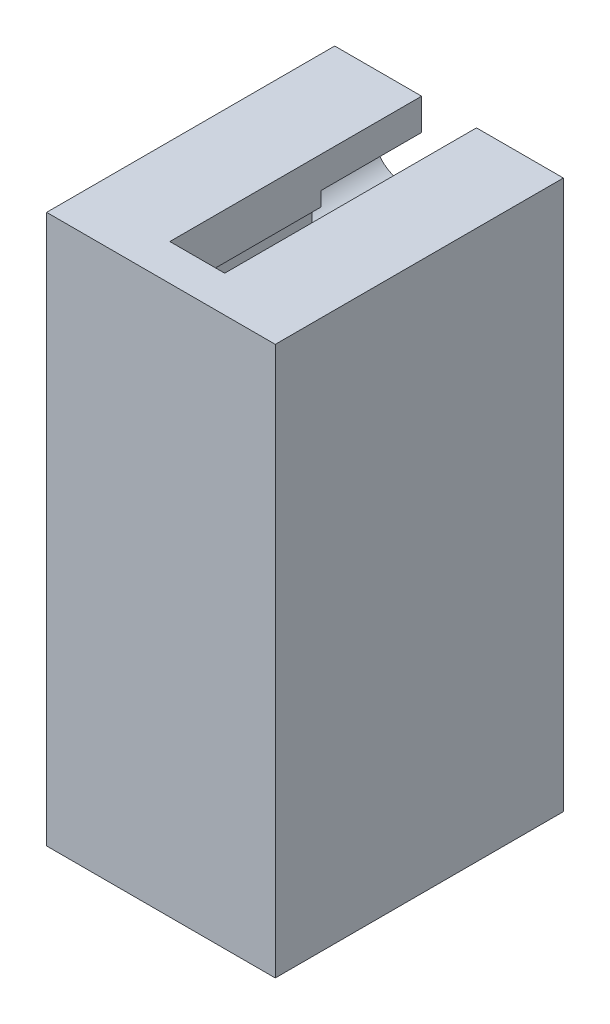
ISO-10303-21;
HEADER;
FILE_DESCRIPTION(('STEP AP214'),'2;1');
FILE_NAME('part.step','',(''),(''),'','','');
FILE_SCHEMA(('AUTOMOTIVE_DESIGN { 1 0 10303 214 1 1 1 1 }'));
ENDSEC;
DATA;
#1=APPLICATION_CONTEXT('core data for automotive mechanical design processes');
#2=APPLICATION_PROTOCOL_DEFINITION('international standard','automotive_design',2000,#1);
#3=PRODUCT_CONTEXT('',#1,'mechanical');
#4=PRODUCT('Part','Part','',(#3));
#5=PRODUCT_RELATED_PRODUCT_CATEGORY('part','',(#4));
#6=PRODUCT_DEFINITION_FORMATION('','',#4);
#7=PRODUCT_DEFINITION_CONTEXT('part definition',#1,'design');
#8=PRODUCT_DEFINITION('design','',#6,#7);
#9=PRODUCT_DEFINITION_SHAPE('','',#8);
#10=(LENGTH_UNIT() NAMED_UNIT(*) SI_UNIT(.MILLI.,.METRE.));
#11=(NAMED_UNIT(*) PLANE_ANGLE_UNIT() SI_UNIT($,.RADIAN.));
#12=(NAMED_UNIT(*) SI_UNIT($,.STERADIAN.) SOLID_ANGLE_UNIT());
#13=UNCERTAINTY_MEASURE_WITH_UNIT(LENGTH_MEASURE(1.E-05),#10,'distance_accuracy_value','');
#14=(GEOMETRIC_REPRESENTATION_CONTEXT(3) GLOBAL_UNCERTAINTY_ASSIGNED_CONTEXT((#13)) GLOBAL_UNIT_ASSIGNED_CONTEXT((#10,
#11,#12)) REPRESENTATION_CONTEXT('',''));
#15=CARTESIAN_POINT('',(0.,0.,0.));
#16=DIRECTION('',(0.,0.,1.));
#17=DIRECTION('',(1.,0.,0.));
#18=AXIS2_PLACEMENT_3D('',#15,#16,#17);
#19=CARTESIAN_POINT('',(0.,45.,-3.96999999999997));
#20=DIRECTION('',(0.,-1.,0.));
#21=DIRECTION('',(0.,0.,-1.));
#22=AXIS2_PLACEMENT_3D('',#19,#20,#21);
#23=PLANE('',#22);
#24=DIRECTION('',(0.,0.,-1.));
#25=VECTOR('',#24,1.);
#26=CARTESIAN_POINT('',(3.,45.,-3.96999999999997));
#27=LINE('',#26,#25);
#28=CARTESIAN_POINT('',(3.,45.,-3.96999999999997));
#29=VERTEX_POINT('',#28);
#30=CARTESIAN_POINT('',(3.,45.,-20.5));
#31=VERTEX_POINT('',#30);
#32=EDGE_CURVE('E244',#29,#31,#27,.T.);
#33=ORIENTED_EDGE('',*,*,#32,.T.);
#34=DIRECTION('',(1.,0.,0.));
#35=VECTOR('',#34,1.);
#36=CARTESIAN_POINT('',(0.,45.,-20.5));
#37=LINE('',#36,#35);
#38=CARTESIAN_POINT('',(4.,45.,-20.5));
#39=VERTEX_POINT('',#38);
#40=EDGE_CURVE('E57',#31,#39,#37,.T.);
#41=ORIENTED_EDGE('',*,*,#40,.T.);
#42=DIRECTION('',(0.,0.,-1.));
#43=VECTOR('',#42,1.);
#44=CARTESIAN_POINT('',(4.,45.,-3.96999999999997));
#45=LINE('',#44,#43);
#46=CARTESIAN_POINT('',(4.,45.,-3.96999999999997));
#47=VERTEX_POINT('',#46);
#48=EDGE_CURVE('E240',#47,#39,#45,.T.);
#49=ORIENTED_EDGE('',*,*,#48,.F.);
#50=DIRECTION('',(-1.,0.,0.));
#51=VECTOR('',#50,1.);
#52=CARTESIAN_POINT('',(0.,45.,-3.96999999999997));
#53=LINE('',#52,#51);
#54=EDGE_CURVE('E333',#47,#29,#53,.T.);
#55=ORIENTED_EDGE('',*,*,#54,.T.);
#56=EDGE_LOOP('',(#33,#41,#49,#55));
#57=FACE_BOUND('',#56,.T.);
#58=ADVANCED_FACE('F41',(#57),#23,.T.);
#59=CARTESIAN_POINT('',(0.,45.,-3.96999999999997));
#60=DIRECTION('',(0.,-1.,0.));
#61=DIRECTION('',(0.,0.,-1.));
#62=AXIS2_PLACEMENT_3D('',#59,#60,#61);
#63=PLANE('',#62);
#64=DIRECTION('',(0.,0.,-1.));
#65=VECTOR('',#64,1.);
#66=CARTESIAN_POINT('',(-4.,45.,-3.96999999999997));
#67=LINE('',#66,#65);
#68=CARTESIAN_POINT('',(-4.,45.,-3.96999999999997));
#69=VERTEX_POINT('',#68);
#70=CARTESIAN_POINT('',(-4.,45.,-20.5));
#71=VERTEX_POINT('',#70);
#72=EDGE_CURVE('E258',#69,#71,#67,.T.);
#73=ORIENTED_EDGE('',*,*,#72,.T.);
#74=DIRECTION('',(1.,0.,0.));
#75=VECTOR('',#74,1.);
#76=CARTESIAN_POINT('',(0.,45.,-20.5));
#77=LINE('',#76,#75);
#78=CARTESIAN_POINT('',(-3.,45.,-20.5));
#79=VERTEX_POINT('',#78);
#80=EDGE_CURVE('E65',#71,#79,#77,.T.);
#81=ORIENTED_EDGE('',*,*,#80,.T.);
#82=DIRECTION('',(0.,0.,-1.));
#83=VECTOR('',#82,1.);
#84=CARTESIAN_POINT('',(-3.,45.,-3.96999999999997));
#85=LINE('',#84,#83);
#86=CARTESIAN_POINT('',(-3.,45.,-3.96999999999997));
#87=VERTEX_POINT('',#86);
#88=EDGE_CURVE('E255',#87,#79,#85,.T.);
#89=ORIENTED_EDGE('',*,*,#88,.F.);
#90=DIRECTION('',(-1.,0.,0.));
#91=VECTOR('',#90,1.);
#92=CARTESIAN_POINT('',(0.,45.,-3.96999999999997));
#93=LINE('',#92,#91);
#94=EDGE_CURVE('E377',#87,#69,#93,.T.);
#95=ORIENTED_EDGE('',*,*,#94,.T.);
#96=EDGE_LOOP('',(#73,#81,#89,#95));
#97=FACE_BOUND('',#96,.T.);
#98=ADVANCED_FACE('F460',(#97),#63,.T.);
#99=CARTESIAN_POINT('',(12.5,0.,-31.5));
#100=DIRECTION('',(0.,0.,-1.));
#101=DIRECTION('',(0.,1.,0.));
#102=AXIS2_PLACEMENT_3D('',#99,#100,#101);
#103=PLANE('',#102);
#104=CARTESIAN_POINT('',(5.,-4.00000000000001,-31.5));
#105=DIRECTION('',(0.,0.,-1.));
#106=DIRECTION('',(0.,1.,0.));
#107=AXIS2_PLACEMENT_3D('',#104,#105,#106);
#108=CIRCLE('',#107,3.25);
#109=CARTESIAN_POINT('',(5.,-0.750000000000013,-31.5));
#110=VERTEX_POINT('',#109);
#111=EDGE_CURVE('E507',#110,#110,#108,.T.);
#112=ORIENTED_EDGE('',*,*,#111,.F.);
#113=EDGE_LOOP('',(#112));
#114=FACE_BOUND('',#113,.T.);
#115=CARTESIAN_POINT('',(-5.,-4.00000000000001,-31.5));
#116=DIRECTION('',(0.,0.,-1.));
#117=DIRECTION('',(0.,1.,0.));
#118=AXIS2_PLACEMENT_3D('',#115,#116,#117);
#119=CIRCLE('',#118,3.25);
#120=CARTESIAN_POINT('',(-5.,-0.750000000000013,-31.5));
#121=VERTEX_POINT('',#120);
#122=EDGE_CURVE('E510',#121,#121,#119,.T.);
#123=ORIENTED_EDGE('',*,*,#122,.F.);
#124=EDGE_LOOP('',(#123));
#125=FACE_BOUND('',#124,.T.);
#126=CARTESIAN_POINT('',(-5.,44.,-31.5));
#127=DIRECTION('',(0.,0.,-1.));
#128=DIRECTION('',(0.,1.,0.));
#129=AXIS2_PLACEMENT_3D('',#126,#127,#128);
#130=CIRCLE('',#129,3.25);
#131=CARTESIAN_POINT('',(-4.,40.9076707807867,-31.5));
#132=VERTEX_POINT('',#131);
#133=CARTESIAN_POINT('',(-3.,46.5617376914899,-31.5));
#134=VERTEX_POINT('',#133);
#135=EDGE_CURVE('E177',#132,#134,#130,.T.);
#136=ORIENTED_EDGE('',*,*,#135,.F.);
#137=DIRECTION('',(0.,-1.,0.));
#138=VECTOR('',#137,1.);
#139=CARTESIAN_POINT('',(-4.,0.,-31.5));
#140=LINE('',#139,#138);
#141=CARTESIAN_POINT('',(-4.,40.015,-31.5));
#142=VERTEX_POINT('',#141);
#143=EDGE_CURVE('E207',#132,#142,#140,.T.);
#144=ORIENTED_EDGE('',*,*,#143,.T.);
#145=DIRECTION('',(1.,0.,0.));
#146=VECTOR('',#145,1.);
#147=CARTESIAN_POINT('',(0.,40.015,-31.5));
#148=LINE('',#147,#146);
#149=CARTESIAN_POINT('',(-10.015,40.015,-31.5));
#150=VERTEX_POINT('',#149);
#151=EDGE_CURVE('E213',#150,#142,#148,.T.);
#152=ORIENTED_EDGE('',*,*,#151,.F.);
#153=DIRECTION('',(0.,1.,0.));
#154=VECTOR('',#153,1.);
#155=CARTESIAN_POINT('',(-10.015,0.,-31.5));
#156=LINE('',#155,#154);
#157=CARTESIAN_POINT('',(-10.015,-0.015000000000007,-31.5));
#158=VERTEX_POINT('',#157);
#159=EDGE_CURVE('E357',#158,#150,#156,.T.);
#160=ORIENTED_EDGE('',*,*,#159,.F.);
#161=DIRECTION('',(1.,0.,0.));
#162=VECTOR('',#161,1.);
#163=CARTESIAN_POINT('',(0.,-0.0150000000000083,-31.5));
#164=LINE('',#163,#162);
#165=CARTESIAN_POINT('',(10.015,-0.0150000000000095,-31.5));
#166=VERTEX_POINT('',#165);
#167=EDGE_CURVE('E353',#158,#166,#164,.T.);
#168=ORIENTED_EDGE('',*,*,#167,.T.);
#169=DIRECTION('',(0.,1.,0.));
#170=VECTOR('',#169,1.);
#171=CARTESIAN_POINT('',(10.015,0.,-31.5));
#172=LINE('',#171,#170);
#173=CARTESIAN_POINT('',(10.015,40.015,-31.5));
#174=VERTEX_POINT('',#173);
#175=EDGE_CURVE('E224',#166,#174,#172,.T.);
#176=ORIENTED_EDGE('',*,*,#175,.T.);
#177=DIRECTION('',(1.,0.,0.));
#178=VECTOR('',#177,1.);
#179=CARTESIAN_POINT('',(0.,40.015,-31.5));
#180=LINE('',#179,#178);
#181=CARTESIAN_POINT('',(4.,40.015,-31.5));
#182=VERTEX_POINT('',#181);
#183=EDGE_CURVE('E220',#182,#174,#180,.T.);
#184=ORIENTED_EDGE('',*,*,#183,.F.);
#185=DIRECTION('',(0.,1.,0.));
#186=VECTOR('',#185,1.);
#187=CARTESIAN_POINT('',(4.,0.,-31.5));
#188=LINE('',#187,#186);
#189=CARTESIAN_POINT('',(4.,40.9076707807867,-31.5));
#190=VERTEX_POINT('',#189);
#191=EDGE_CURVE('E211',#182,#190,#188,.T.);
#192=ORIENTED_EDGE('',*,*,#191,.T.);
#193=CARTESIAN_POINT('',(5.,44.,-31.5));
#194=DIRECTION('',(0.,0.,-1.));
#195=DIRECTION('',(0.,1.,0.));
#196=AXIS2_PLACEMENT_3D('',#193,#194,#195);
#197=CIRCLE('',#196,3.25);
#198=CARTESIAN_POINT('',(3.,46.5617376914899,-31.5));
#199=VERTEX_POINT('',#198);
#200=EDGE_CURVE('E399',#199,#190,#197,.T.);
#201=ORIENTED_EDGE('',*,*,#200,.F.);
#202=DIRECTION('',(0.,1.,0.));
#203=VECTOR('',#202,1.);
#204=CARTESIAN_POINT('',(3.,0.,-31.5));
#205=LINE('',#204,#203);
#206=CARTESIAN_POINT('',(3.,50.,-31.5));
#207=VERTEX_POINT('',#206);
#208=EDGE_CURVE('E206',#199,#207,#205,.T.);
#209=ORIENTED_EDGE('',*,*,#208,.T.);
#210=DIRECTION('',(-1.,0.,0.));
#211=VECTOR('',#210,1.);
#212=CARTESIAN_POINT('',(12.5,50.,-31.5));
#213=LINE('',#212,#211);
#214=CARTESIAN_POINT('',(12.5,50.,-31.5));
#215=VERTEX_POINT('',#214);
#216=EDGE_CURVE('E313',#215,#207,#213,.T.);
#217=ORIENTED_EDGE('',*,*,#216,.F.);
#218=DIRECTION('',(0.,-1.,0.));
#219=VECTOR('',#218,1.);
#220=CARTESIAN_POINT('',(12.5,0.,-31.5));
#221=LINE('',#220,#219);
#222=CARTESIAN_POINT('',(12.5,-10.,-31.5));
#223=VERTEX_POINT('',#222);
#224=EDGE_CURVE('E273',#215,#223,#221,.T.);
#225=ORIENTED_EDGE('',*,*,#224,.T.);
#226=DIRECTION('',(-1.,0.,0.));
#227=VECTOR('',#226,1.);
#228=CARTESIAN_POINT('',(12.5,-10.,-31.5));
#229=LINE('',#228,#227);
#230=CARTESIAN_POINT('',(-12.5,-10.,-31.5));
#231=VERTEX_POINT('',#230);
#232=EDGE_CURVE('E290',#223,#231,#229,.T.);
#233=ORIENTED_EDGE('',*,*,#232,.T.);
#234=DIRECTION('',(0.,-1.,0.));
#235=VECTOR('',#234,1.);
#236=CARTESIAN_POINT('',(-12.5,0.,-31.5));
#237=LINE('',#236,#235);
#238=CARTESIAN_POINT('',(-12.5,50.,-31.5));
#239=VERTEX_POINT('',#238);
#240=EDGE_CURVE('E233',#239,#231,#237,.T.);
#241=ORIENTED_EDGE('',*,*,#240,.F.);
#242=CARTESIAN_POINT('',(-3.,50.,-31.5));
#243=VERTEX_POINT('',#242);
#244=EDGE_CURVE('E204',#243,#239,#213,.T.);
#245=ORIENTED_EDGE('',*,*,#244,.F.);
#246=DIRECTION('',(0.,-1.,0.));
#247=VECTOR('',#246,1.);
#248=CARTESIAN_POINT('',(-3.,0.,-31.5));
#249=LINE('',#248,#247);
#250=EDGE_CURVE('E196',#243,#134,#249,.T.);
#251=ORIENTED_EDGE('',*,*,#250,.T.);
#252=EDGE_LOOP('',(#136,#144,#152,#160,#168,#176,#184,#192,#201,#209,#217,#225,#233,#241,#245,#251));
#253=FACE_BOUND('',#252,.T.);
#254=ADVANCED_FACE('F43',(#114,#125,#253),#103,.T.);
#255=CARTESIAN_POINT('',(12.5,50.,0.));
#256=DIRECTION('',(0.,1.,0.));
#257=DIRECTION('',(0.,0.,1.));
#258=AXIS2_PLACEMENT_3D('',#255,#256,#257);
#259=PLANE('',#258);
#260=ORIENTED_EDGE('',*,*,#216,.T.);
#261=DIRECTION('',(0.,0.,-1.));
#262=VECTOR('',#261,1.);
#263=CARTESIAN_POINT('',(3.,50.,-3.96999999999997));
#264=LINE('',#263,#262);
#265=CARTESIAN_POINT('',(3.,50.,-3.96999999999997));
#266=VERTEX_POINT('',#265);
#267=EDGE_CURVE('E248',#266,#207,#264,.T.);
#268=ORIENTED_EDGE('',*,*,#267,.F.);
#269=DIRECTION('',(1.,0.,0.));
#270=VECTOR('',#269,1.);
#271=CARTESIAN_POINT('',(0.,50.,-3.96999999999997));
#272=LINE('',#271,#270);
#273=CARTESIAN_POINT('',(-3.,50.,-3.96999999999997));
#274=VERTEX_POINT('',#273);
#275=EDGE_CURVE('E344',#274,#266,#272,.T.);
#276=ORIENTED_EDGE('',*,*,#275,.F.);
#277=DIRECTION('',(0.,0.,-1.));
#278=VECTOR('',#277,1.);
#279=CARTESIAN_POINT('',(-3.,50.,-3.96999999999997));
#280=LINE('',#279,#278);
#281=EDGE_CURVE('E252',#274,#243,#280,.T.);
#282=ORIENTED_EDGE('',*,*,#281,.T.);
#283=ORIENTED_EDGE('',*,*,#244,.T.);
#284=DIRECTION('',(0.,0.,-1.));
#285=VECTOR('',#284,1.);
#286=CARTESIAN_POINT('',(-12.5,50.,0.));
#287=LINE('',#286,#285);
#288=CARTESIAN_POINT('',(-12.5,50.,0.));
#289=VERTEX_POINT('',#288);
#290=EDGE_CURVE('E294',#289,#239,#287,.T.);
#291=ORIENTED_EDGE('',*,*,#290,.F.);
#292=DIRECTION('',(-1.,0.,0.));
#293=VECTOR('',#292,1.);
#294=CARTESIAN_POINT('',(12.5,50.,0.));
#295=LINE('',#294,#293);
#296=CARTESIAN_POINT('',(12.5,50.,0.));
#297=VERTEX_POINT('',#296);
#298=EDGE_CURVE('E310',#297,#289,#295,.T.);
#299=ORIENTED_EDGE('',*,*,#298,.F.);
#300=DIRECTION('',(0.,0.,-1.));
#301=VECTOR('',#300,1.);
#302=CARTESIAN_POINT('',(12.5,50.,0.));
#303=LINE('',#302,#301);
#304=EDGE_CURVE('E277',#297,#215,#303,.T.);
#305=ORIENTED_EDGE('',*,*,#304,.T.);
#306=EDGE_LOOP('',(#260,#268,#276,#282,#283,#291,#299,#305));
#307=FACE_BOUND('',#306,.T.);
#308=ADVANCED_FACE('F396',(#307),#259,.T.);
#309=CARTESIAN_POINT('',(12.5,0.,0.));
#310=DIRECTION('',(0.,0.,1.));
#311=DIRECTION('',(1.,0.,0.));
#312=AXIS2_PLACEMENT_3D('',#309,#310,#311);
#313=PLANE('',#312);
#314=DIRECTION('',(0.,1.,0.));
#315=VECTOR('',#314,1.);
#316=CARTESIAN_POINT('',(-12.5,0.,0.));
#317=LINE('',#316,#315);
#318=CARTESIAN_POINT('',(-12.5,-10.,0.));
#319=VERTEX_POINT('',#318);
#320=EDGE_CURVE('E298',#319,#289,#317,.T.);
#321=ORIENTED_EDGE('',*,*,#320,.F.);
#322=DIRECTION('',(-1.,0.,0.));
#323=VECTOR('',#322,1.);
#324=CARTESIAN_POINT('',(12.5,-10.,0.));
#325=LINE('',#324,#323);
#326=CARTESIAN_POINT('',(12.5,-10.,0.));
#327=VERTEX_POINT('',#326);
#328=EDGE_CURVE('E307',#327,#319,#325,.T.);
#329=ORIENTED_EDGE('',*,*,#328,.F.);
#330=DIRECTION('',(0.,1.,0.));
#331=VECTOR('',#330,1.);
#332=CARTESIAN_POINT('',(12.5,0.,0.));
#333=LINE('',#332,#331);
#334=EDGE_CURVE('E282',#327,#297,#333,.T.);
#335=ORIENTED_EDGE('',*,*,#334,.T.);
#336=ORIENTED_EDGE('',*,*,#298,.T.);
#337=EDGE_LOOP('',(#321,#329,#335,#336));
#338=FACE_BOUND('',#337,.T.);
#339=ADVANCED_FACE('F493',(#338),#313,.T.);
#340=CARTESIAN_POINT('',(12.5,-10.,0.));
#341=DIRECTION('',(0.,-1.,0.));
#342=DIRECTION('',(0.,0.,-1.));
#343=AXIS2_PLACEMENT_3D('',#340,#341,#342);
#344=PLANE('',#343);
#345=DIRECTION('',(0.,0.,1.));
#346=VECTOR('',#345,1.);
#347=CARTESIAN_POINT('',(-12.5,-10.,0.));
#348=LINE('',#347,#346);
#349=EDGE_CURVE('E278',#231,#319,#348,.T.);
#350=ORIENTED_EDGE('',*,*,#349,.F.);
#351=ORIENTED_EDGE('',*,*,#232,.F.);
#352=DIRECTION('',(0.,0.,1.));
#353=VECTOR('',#352,1.);
#354=CARTESIAN_POINT('',(12.5,-10.,0.));
#355=LINE('',#354,#353);
#356=EDGE_CURVE('E286',#223,#327,#355,.T.);
#357=ORIENTED_EDGE('',*,*,#356,.T.);
#358=ORIENTED_EDGE('',*,*,#328,.T.);
#359=EDGE_LOOP('',(#350,#351,#357,#358));
#360=FACE_BOUND('',#359,.T.);
#361=ADVANCED_FACE('F486',(#360),#344,.T.);
#362=CARTESIAN_POINT('',(12.5,0.,0.));
#363=DIRECTION('',(1.,0.,0.));
#364=DIRECTION('',(0.,0.,-1.));
#365=AXIS2_PLACEMENT_3D('',#362,#363,#364);
#366=PLANE('',#365);
#367=ORIENTED_EDGE('',*,*,#224,.F.);
#368=ORIENTED_EDGE('',*,*,#304,.F.);
#369=ORIENTED_EDGE('',*,*,#334,.F.);
#370=ORIENTED_EDGE('',*,*,#356,.F.);
#371=EDGE_LOOP('',(#367,#368,#369,#370));
#372=FACE_BOUND('',#371,.T.);
#373=ADVANCED_FACE('F483',(#372),#366,.T.);
#374=CARTESIAN_POINT('',(-12.5,0.,0.));
#375=DIRECTION('',(1.,0.,0.));
#376=DIRECTION('',(0.,0.,-1.));
#377=AXIS2_PLACEMENT_3D('',#374,#375,#376);
#378=PLANE('',#377);
#379=ORIENTED_EDGE('',*,*,#240,.T.);
#380=ORIENTED_EDGE('',*,*,#349,.T.);
#381=ORIENTED_EDGE('',*,*,#320,.T.);
#382=ORIENTED_EDGE('',*,*,#290,.T.);
#383=EDGE_LOOP('',(#379,#380,#381,#382));
#384=FACE_BOUND('',#383,.T.);
#385=ADVANCED_FACE('F482',(#384),#378,.F.);
#386=CARTESIAN_POINT('',(0.,-0.0150000000000178,-3.96999999999999));
#387=DIRECTION('',(0.,1.,0.));
#388=DIRECTION('',(0.,0.,1.));
#389=AXIS2_PLACEMENT_3D('',#386,#387,#388);
#390=PLANE('',#389);
#391=ORIENTED_EDGE('',*,*,#167,.F.);
#392=DIRECTION('',(0.,0.,-1.));
#393=VECTOR('',#392,1.);
#394=CARTESIAN_POINT('',(-10.015,-0.0150000000000166,-3.96999999999999));
#395=LINE('',#394,#393);
#396=CARTESIAN_POINT('',(-10.015,-0.0150000000000166,-3.96999999999999));
#397=VERTEX_POINT('',#396);
#398=EDGE_CURVE('E269',#397,#158,#395,.T.);
#399=ORIENTED_EDGE('',*,*,#398,.F.);
#400=DIRECTION('',(1.,0.,0.));
#401=VECTOR('',#400,1.);
#402=CARTESIAN_POINT('',(0.,-0.0150000000000178,-3.96999999999999));
#403=LINE('',#402,#401);
#404=CARTESIAN_POINT('',(10.015,-0.015000000000019,-3.96999999999999));
#405=VERTEX_POINT('',#404);
#406=EDGE_CURVE('E228',#397,#405,#403,.T.);
#407=ORIENTED_EDGE('',*,*,#406,.T.);
#408=DIRECTION('',(0.,0.,-1.));
#409=VECTOR('',#408,1.);
#410=CARTESIAN_POINT('',(10.015,-0.015000000000019,-3.96999999999999));
#411=LINE('',#410,#409);
#412=EDGE_CURVE('E229',#405,#166,#411,.T.);
#413=ORIENTED_EDGE('',*,*,#412,.T.);
#414=EDGE_LOOP('',(#391,#399,#407,#413));
#415=FACE_BOUND('',#414,.T.);
#416=ADVANCED_FACE('F434',(#415),#390,.T.);
#417=CARTESIAN_POINT('',(10.015,0.,-3.96999999999999));
#418=DIRECTION('',(-1.,0.,0.));
#419=DIRECTION('',(0.,0.,1.));
#420=AXIS2_PLACEMENT_3D('',#417,#418,#419);
#421=PLANE('',#420);
#422=ORIENTED_EDGE('',*,*,#175,.F.);
#423=ORIENTED_EDGE('',*,*,#412,.F.);
#424=DIRECTION('',(0.,1.,0.));
#425=VECTOR('',#424,1.);
#426=CARTESIAN_POINT('',(10.015,0.,-3.96999999999999));
#427=LINE('',#426,#425);
#428=CARTESIAN_POINT('',(10.015,40.015,-3.96999999999998));
#429=VERTEX_POINT('',#428);
#430=EDGE_CURVE('E272',#405,#429,#427,.T.);
#431=ORIENTED_EDGE('',*,*,#430,.T.);
#432=DIRECTION('',(0.,0.,-1.));
#433=VECTOR('',#432,1.);
#434=CARTESIAN_POINT('',(10.015,40.015,-3.96999999999998));
#435=LINE('',#434,#433);
#436=EDGE_CURVE('E234',#429,#174,#435,.T.);
#437=ORIENTED_EDGE('',*,*,#436,.T.);
#438=EDGE_LOOP('',(#422,#423,#431,#437));
#439=FACE_BOUND('',#438,.T.);
#440=ADVANCED_FACE('F437',(#439),#421,.T.);
#441=CARTESIAN_POINT('',(0.,40.015,-3.96999999999998));
#442=DIRECTION('',(0.,1.,0.));
#443=DIRECTION('',(0.,0.,1.));
#444=AXIS2_PLACEMENT_3D('',#441,#442,#443);
#445=PLANE('',#444);
#446=ORIENTED_EDGE('',*,*,#183,.T.);
#447=ORIENTED_EDGE('',*,*,#436,.F.);
#448=DIRECTION('',(1.,0.,0.));
#449=VECTOR('',#448,1.);
#450=CARTESIAN_POINT('',(0.,40.015,-3.96999999999998));
#451=LINE('',#450,#449);
#452=CARTESIAN_POINT('',(4.,40.015,-3.96999999999998));
#453=VERTEX_POINT('',#452);
#454=EDGE_CURVE('E342',#453,#429,#451,.T.);
#455=ORIENTED_EDGE('',*,*,#454,.F.);
#456=DIRECTION('',(0.,0.,-1.));
#457=VECTOR('',#456,1.);
#458=CARTESIAN_POINT('',(4.,40.015,-3.96999999999998));
#459=LINE('',#458,#457);
#460=EDGE_CURVE('E237',#453,#182,#459,.T.);
#461=ORIENTED_EDGE('',*,*,#460,.T.);
#462=EDGE_LOOP('',(#446,#447,#455,#461));
#463=FACE_BOUND('',#462,.T.);
#464=ADVANCED_FACE('F441',(#463),#445,.F.);
#465=CARTESIAN_POINT('',(4.,0.,-3.96999999999999));
#466=DIRECTION('',(-1.,0.,0.));
#467=DIRECTION('',(0.,0.,1.));
#468=AXIS2_PLACEMENT_3D('',#465,#466,#467);
#469=PLANE('',#468);
#470=DIRECTION('',(0.,0.,-1.));
#471=VECTOR('',#470,1.);
#472=CARTESIAN_POINT('',(4.,40.9076707807867,-20.5));
#473=LINE('',#472,#471);
#474=CARTESIAN_POINT('',(4.,40.9076707807867,-20.5));
#475=VERTEX_POINT('',#474);
#476=EDGE_CURVE('E358',#190,#475,#473,.F.);
#477=ORIENTED_EDGE('',*,*,#476,.F.);
#478=ORIENTED_EDGE('',*,*,#191,.F.);
#479=ORIENTED_EDGE('',*,*,#460,.F.);
#480=DIRECTION('',(0.,1.,0.));
#481=VECTOR('',#480,1.);
#482=CARTESIAN_POINT('',(4.,0.,-3.96999999999999));
#483=LINE('',#482,#481);
#484=EDGE_CURVE('E337',#453,#47,#483,.T.);
#485=ORIENTED_EDGE('',*,*,#484,.T.);
#486=ORIENTED_EDGE('',*,*,#48,.T.);
#487=DIRECTION('',(0.,-1.,0.));
#488=VECTOR('',#487,1.);
#489=CARTESIAN_POINT('',(4.,0.,-20.5));
#490=LINE('',#489,#488);
#491=EDGE_CURVE('E419',#39,#475,#490,.T.);
#492=ORIENTED_EDGE('',*,*,#491,.T.);
#493=EDGE_LOOP('',(#477,#478,#479,#485,#486,#492));
#494=FACE_BOUND('',#493,.T.);
#495=ADVANCED_FACE('F443',(#494),#469,.T.);
#496=CARTESIAN_POINT('',(3.,0.,-3.96999999999999));
#497=DIRECTION('',(-1.,0.,0.));
#498=DIRECTION('',(0.,-1.,0.));
#499=AXIS2_PLACEMENT_3D('',#496,#497,#498);
#500=PLANE('',#499);
#501=DIRECTION('',(0.,0.,-1.));
#502=VECTOR('',#501,1.);
#503=CARTESIAN_POINT('',(3.,46.5617376914899,-20.5));
#504=LINE('',#503,#502);
#505=CARTESIAN_POINT('',(3.,46.5617376914899,-20.5));
#506=VERTEX_POINT('',#505);
#507=EDGE_CURVE('E11',#506,#199,#504,.T.);
#508=ORIENTED_EDGE('',*,*,#507,.F.);
#509=DIRECTION('',(0.,-1.,0.));
#510=VECTOR('',#509,1.);
#511=CARTESIAN_POINT('',(3.,0.,-20.5));
#512=LINE('',#511,#510);
#513=EDGE_CURVE('E50',#506,#31,#512,.T.);
#514=ORIENTED_EDGE('',*,*,#513,.T.);
#515=ORIENTED_EDGE('',*,*,#32,.F.);
#516=DIRECTION('',(0.,1.,0.));
#517=VECTOR('',#516,1.);
#518=CARTESIAN_POINT('',(3.,0.,-3.96999999999999));
#519=LINE('',#518,#517);
#520=EDGE_CURVE('E338',#29,#266,#519,.T.);
#521=ORIENTED_EDGE('',*,*,#520,.T.);
#522=ORIENTED_EDGE('',*,*,#267,.T.);
#523=ORIENTED_EDGE('',*,*,#208,.F.);
#524=EDGE_LOOP('',(#508,#514,#515,#521,#522,#523));
#525=FACE_BOUND('',#524,.T.);
#526=ADVANCED_FACE('F325',(#525),#500,.T.);
#527=CARTESIAN_POINT('',(-3.,0.,-3.96999999999999));
#528=DIRECTION('',(1.,0.,0.));
#529=DIRECTION('',(0.,0.,-1.));
#530=AXIS2_PLACEMENT_3D('',#527,#528,#529);
#531=PLANE('',#530);
#532=DIRECTION('',(0.,0.,-1.));
#533=VECTOR('',#532,1.);
#534=CARTESIAN_POINT('',(-3.,46.5617376914899,-20.5));
#535=LINE('',#534,#533);
#536=CARTESIAN_POINT('',(-3.,46.5617376914899,-20.5));
#537=VERTEX_POINT('',#536);
#538=EDGE_CURVE('E181',#134,#537,#535,.F.);
#539=ORIENTED_EDGE('',*,*,#538,.F.);
#540=ORIENTED_EDGE('',*,*,#250,.F.);
#541=ORIENTED_EDGE('',*,*,#281,.F.);
#542=DIRECTION('',(0.,-1.,0.));
#543=VECTOR('',#542,1.);
#544=CARTESIAN_POINT('',(-3.,0.,-3.96999999999999));
#545=LINE('',#544,#543);
#546=EDGE_CURVE('E382',#274,#87,#545,.T.);
#547=ORIENTED_EDGE('',*,*,#546,.T.);
#548=ORIENTED_EDGE('',*,*,#88,.T.);
#549=DIRECTION('',(0.,1.,0.));
#550=VECTOR('',#549,1.);
#551=CARTESIAN_POINT('',(-3.,0.,-20.5));
#552=LINE('',#551,#550);
#553=EDGE_CURVE('E199',#79,#537,#552,.T.);
#554=ORIENTED_EDGE('',*,*,#553,.T.);
#555=EDGE_LOOP('',(#539,#540,#541,#547,#548,#554));
#556=FACE_BOUND('',#555,.T.);
#557=ADVANCED_FACE('F194',(#556),#531,.T.);
#558=CARTESIAN_POINT('',(-4.,0.,-3.96999999999999));
#559=DIRECTION('',(1.,0.,0.));
#560=DIRECTION('',(0.,0.,-1.));
#561=AXIS2_PLACEMENT_3D('',#558,#559,#560);
#562=PLANE('',#561);
#563=DIRECTION('',(0.,0.,-1.));
#564=VECTOR('',#563,1.);
#565=CARTESIAN_POINT('',(-4.,40.9076707807867,-20.5));
#566=LINE('',#565,#564);
#567=CARTESIAN_POINT('',(-4.,40.9076707807867,-20.5));
#568=VERTEX_POINT('',#567);
#569=EDGE_CURVE('E184',#568,#132,#566,.T.);
#570=ORIENTED_EDGE('',*,*,#569,.F.);
#571=DIRECTION('',(0.,1.,0.));
#572=VECTOR('',#571,1.);
#573=CARTESIAN_POINT('',(-4.,0.,-20.5));
#574=LINE('',#573,#572);
#575=EDGE_CURVE('E317',#568,#71,#574,.T.);
#576=ORIENTED_EDGE('',*,*,#575,.T.);
#577=ORIENTED_EDGE('',*,*,#72,.F.);
#578=DIRECTION('',(0.,-1.,0.));
#579=VECTOR('',#578,1.);
#580=CARTESIAN_POINT('',(-4.,0.,-3.96999999999999));
#581=LINE('',#580,#579);
#582=CARTESIAN_POINT('',(-4.,40.015,-3.96999999999998));
#583=VERTEX_POINT('',#582);
#584=EDGE_CURVE('E374',#69,#583,#581,.T.);
#585=ORIENTED_EDGE('',*,*,#584,.T.);
#586=DIRECTION('',(0.,0.,-1.));
#587=VECTOR('',#586,1.);
#588=CARTESIAN_POINT('',(-4.,40.015,-3.96999999999998));
#589=LINE('',#588,#587);
#590=EDGE_CURVE('E262',#583,#142,#589,.T.);
#591=ORIENTED_EDGE('',*,*,#590,.T.);
#592=ORIENTED_EDGE('',*,*,#143,.F.);
#593=EDGE_LOOP('',(#570,#576,#577,#585,#591,#592));
#594=FACE_BOUND('',#593,.T.);
#595=ADVANCED_FACE('F371',(#594),#562,.T.);
#596=CARTESIAN_POINT('',(0.,40.015,-3.96999999999998));
#597=DIRECTION('',(0.,1.,0.));
#598=DIRECTION('',(0.,0.,1.));
#599=AXIS2_PLACEMENT_3D('',#596,#597,#598);
#600=PLANE('',#599);
#601=ORIENTED_EDGE('',*,*,#151,.T.);
#602=ORIENTED_EDGE('',*,*,#590,.F.);
#603=DIRECTION('',(1.,0.,0.));
#604=VECTOR('',#603,1.);
#605=CARTESIAN_POINT('',(0.,40.015,-3.96999999999998));
#606=LINE('',#605,#604);
#607=CARTESIAN_POINT('',(-10.015,40.015,-3.96999999999998));
#608=VERTEX_POINT('',#607);
#609=EDGE_CURVE('E378',#608,#583,#606,.T.);
#610=ORIENTED_EDGE('',*,*,#609,.F.);
#611=DIRECTION('',(0.,0.,-1.));
#612=VECTOR('',#611,1.);
#613=CARTESIAN_POINT('',(-10.015,40.015,-3.96999999999998));
#614=LINE('',#613,#612);
#615=EDGE_CURVE('E266',#608,#150,#614,.T.);
#616=ORIENTED_EDGE('',*,*,#615,.T.);
#617=EDGE_LOOP('',(#601,#602,#610,#616));
#618=FACE_BOUND('',#617,.T.);
#619=ADVANCED_FACE('F366',(#618),#600,.F.);
#620=CARTESIAN_POINT('',(-10.015,0.,-3.96999999999999));
#621=DIRECTION('',(-1.,0.,0.));
#622=DIRECTION('',(0.,0.,1.));
#623=AXIS2_PLACEMENT_3D('',#620,#621,#622);
#624=PLANE('',#623);
#625=ORIENTED_EDGE('',*,*,#159,.T.);
#626=ORIENTED_EDGE('',*,*,#615,.F.);
#627=DIRECTION('',(0.,1.,0.));
#628=VECTOR('',#627,1.);
#629=CARTESIAN_POINT('',(-10.015,0.,-3.96999999999999));
#630=LINE('',#629,#628);
#631=EDGE_CURVE('E384',#397,#608,#630,.T.);
#632=ORIENTED_EDGE('',*,*,#631,.F.);
#633=ORIENTED_EDGE('',*,*,#398,.T.);
#634=EDGE_LOOP('',(#625,#626,#632,#633));
#635=FACE_BOUND('',#634,.T.);
#636=ADVANCED_FACE('F431',(#635),#624,.F.);
#637=CARTESIAN_POINT('',(0.,0.,-3.96999999999999));
#638=DIRECTION('',(0.,0.,-1.));
#639=DIRECTION('',(0.,1.,0.));
#640=AXIS2_PLACEMENT_3D('',#637,#638,#639);
#641=PLANE('',#640);
#642=ORIENTED_EDGE('',*,*,#406,.F.);
#643=ORIENTED_EDGE('',*,*,#631,.T.);
#644=ORIENTED_EDGE('',*,*,#609,.T.);
#645=ORIENTED_EDGE('',*,*,#584,.F.);
#646=ORIENTED_EDGE('',*,*,#94,.F.);
#647=ORIENTED_EDGE('',*,*,#546,.F.);
#648=ORIENTED_EDGE('',*,*,#275,.T.);
#649=ORIENTED_EDGE('',*,*,#520,.F.);
#650=ORIENTED_EDGE('',*,*,#54,.F.);
#651=ORIENTED_EDGE('',*,*,#484,.F.);
#652=ORIENTED_EDGE('',*,*,#454,.T.);
#653=ORIENTED_EDGE('',*,*,#430,.F.);
#654=EDGE_LOOP('',(#642,#643,#644,#645,#646,#647,#648,#649,#650,#651,#652,#653));
#655=FACE_BOUND('',#654,.T.);
#656=ADVANCED_FACE('F394',(#655),#641,.T.);
#657=CARTESIAN_POINT('',(-5.,44.,-20.5));
#658=DIRECTION('',(0.,0.,-1.));
#659=DIRECTION('',(0.,1.,0.));
#660=AXIS2_PLACEMENT_3D('',#657,#658,#659);
#661=CYLINDRICAL_SURFACE('',#660,3.25);
#662=ORIENTED_EDGE('',*,*,#538,.T.);
#663=CARTESIAN_POINT('',(-5.,44.,-20.5));
#664=DIRECTION('',(0.,0.,-1.));
#665=DIRECTION('',(0.,1.,0.));
#666=AXIS2_PLACEMENT_3D('',#663,#664,#665);
#667=CIRCLE('',#666,3.25);
#668=EDGE_CURVE('E189',#568,#537,#667,.T.);
#669=ORIENTED_EDGE('',*,*,#668,.F.);
#670=ORIENTED_EDGE('',*,*,#569,.T.);
#671=ORIENTED_EDGE('',*,*,#135,.T.);
#672=EDGE_LOOP('',(#662,#669,#670,#671));
#673=FACE_BOUND('',#672,.T.);
#674=ADVANCED_FACE('F179',(#673),#661,.F.);
#675=CARTESIAN_POINT('',(-5.,44.,-20.5));
#676=DIRECTION('',(0.,0.,-1.));
#677=DIRECTION('',(0.,1.,0.));
#678=AXIS2_PLACEMENT_3D('',#675,#676,#677);
#679=PLANE('',#678);
#680=ORIENTED_EDGE('',*,*,#80,.F.);
#681=ORIENTED_EDGE('',*,*,#575,.F.);
#682=ORIENTED_EDGE('',*,*,#668,.T.);
#683=ORIENTED_EDGE('',*,*,#553,.F.);
#684=EDGE_LOOP('',(#680,#681,#682,#683));
#685=FACE_BOUND('',#684,.T.);
#686=ADVANCED_FACE('F456',(#685),#679,.T.);
#687=CARTESIAN_POINT('',(5.,44.,-20.5));
#688=DIRECTION('',(0.,0.,-1.));
#689=DIRECTION('',(0.,1.,0.));
#690=AXIS2_PLACEMENT_3D('',#687,#688,#689);
#691=CYLINDRICAL_SURFACE('',#690,3.25);
#692=ORIENTED_EDGE('',*,*,#476,.T.);
#693=CARTESIAN_POINT('',(5.,44.,-20.5));
#694=DIRECTION('',(0.,0.,-1.));
#695=DIRECTION('',(0.,1.,0.));
#696=AXIS2_PLACEMENT_3D('',#693,#694,#695);
#697=CIRCLE('',#696,3.25);
#698=EDGE_CURVE('E405',#506,#475,#697,.T.);
#699=ORIENTED_EDGE('',*,*,#698,.F.);
#700=ORIENTED_EDGE('',*,*,#507,.T.);
#701=ORIENTED_EDGE('',*,*,#200,.T.);
#702=EDGE_LOOP('',(#692,#699,#700,#701));
#703=FACE_BOUND('',#702,.T.);
#704=ADVANCED_FACE('F444',(#703),#691,.F.);
#705=CARTESIAN_POINT('',(5.,44.,-20.5));
#706=DIRECTION('',(0.,0.,-1.));
#707=DIRECTION('',(0.,1.,0.));
#708=AXIS2_PLACEMENT_3D('',#705,#706,#707);
#709=PLANE('',#708);
#710=ORIENTED_EDGE('',*,*,#40,.F.);
#711=ORIENTED_EDGE('',*,*,#513,.F.);
#712=ORIENTED_EDGE('',*,*,#698,.T.);
#713=ORIENTED_EDGE('',*,*,#491,.F.);
#714=EDGE_LOOP('',(#710,#711,#712,#713));
#715=FACE_BOUND('',#714,.T.);
#716=ADVANCED_FACE('F445',(#715),#709,.T.);
#717=CARTESIAN_POINT('',(-5.,-4.00000000000001,-20.5));
#718=DIRECTION('',(0.,0.,-1.));
#719=DIRECTION('',(0.,1.,0.));
#720=AXIS2_PLACEMENT_3D('',#717,#718,#719);
#721=CYLINDRICAL_SURFACE('',#720,3.25);
#722=CARTESIAN_POINT('',(-5.,-4.00000000000001,-20.5));
#723=DIRECTION('',(0.,0.,-1.));
#724=DIRECTION('',(0.,1.,0.));
#725=AXIS2_PLACEMENT_3D('',#722,#723,#724);
#726=CIRCLE('',#725,3.25);
#727=CARTESIAN_POINT('',(-5.,-0.750000000000011,-20.5));
#728=VERTEX_POINT('',#727);
#729=EDGE_CURVE('E190',#728,#728,#726,.T.);
#730=ORIENTED_EDGE('',*,*,#729,.F.);
#731=EDGE_LOOP('',(#730));
#732=FACE_BOUND('',#731,.T.);
#733=ORIENTED_EDGE('',*,*,#122,.T.);
#734=EDGE_LOOP('',(#733));
#735=FACE_BOUND('',#734,.T.);
#736=ADVANCED_FACE('F447',(#732,#735),#721,.F.);
#737=CARTESIAN_POINT('',(-5.,-4.00000000000001,-20.5));
#738=DIRECTION('',(0.,0.,-1.));
#739=DIRECTION('',(0.,1.,0.));
#740=AXIS2_PLACEMENT_3D('',#737,#738,#739);
#741=PLANE('',#740);
#742=ORIENTED_EDGE('',*,*,#729,.T.);
#743=EDGE_LOOP('',(#742));
#744=FACE_BOUND('',#743,.T.);
#745=ADVANCED_FACE('F453',(#744),#741,.T.);
#746=CARTESIAN_POINT('',(5.,-4.00000000000001,-20.5));
#747=DIRECTION('',(0.,0.,-1.));
#748=DIRECTION('',(0.,1.,0.));
#749=AXIS2_PLACEMENT_3D('',#746,#747,#748);
#750=CYLINDRICAL_SURFACE('',#749,3.25);
#751=CARTESIAN_POINT('',(5.,-4.00000000000001,-20.5));
#752=DIRECTION('',(0.,0.,-1.));
#753=DIRECTION('',(0.,1.,0.));
#754=AXIS2_PLACEMENT_3D('',#751,#752,#753);
#755=CIRCLE('',#754,3.25);
#756=CARTESIAN_POINT('',(5.,-0.750000000000011,-20.5));
#757=VERTEX_POINT('',#756);
#758=EDGE_CURVE('E513',#757,#757,#755,.T.);
#759=ORIENTED_EDGE('',*,*,#758,.F.);
#760=EDGE_LOOP('',(#759));
#761=FACE_BOUND('',#760,.T.);
#762=ORIENTED_EDGE('',*,*,#111,.T.);
#763=EDGE_LOOP('',(#762));
#764=FACE_BOUND('',#763,.T.);
#765=ADVANCED_FACE('F523',(#761,#764),#750,.F.);
#766=CARTESIAN_POINT('',(5.,-4.00000000000001,-20.5));
#767=DIRECTION('',(0.,0.,-1.));
#768=DIRECTION('',(0.,1.,0.));
#769=AXIS2_PLACEMENT_3D('',#766,#767,#768);
#770=PLANE('',#769);
#771=ORIENTED_EDGE('',*,*,#758,.T.);
#772=EDGE_LOOP('',(#771));
#773=FACE_BOUND('',#772,.T.);
#774=ADVANCED_FACE('F525',(#773),#770,.T.);
#775=CLOSED_SHELL('',(#58,#98,#254,#308,#339,#361,#373,#385,#416,#440,#464,#495,#526,#557,#595,
#619,#636,#656,#674,#686,#704,#716,#736,#745,#765,#774));
#776=MANIFOLD_SOLID_BREP('B2',#775);
#777=ADVANCED_BREP_SHAPE_REPRESENTATION('',(#18,#776),#14);
#778=SHAPE_DEFINITION_REPRESENTATION(#9,#777);
ENDSEC;
END-ISO-10303-21;
